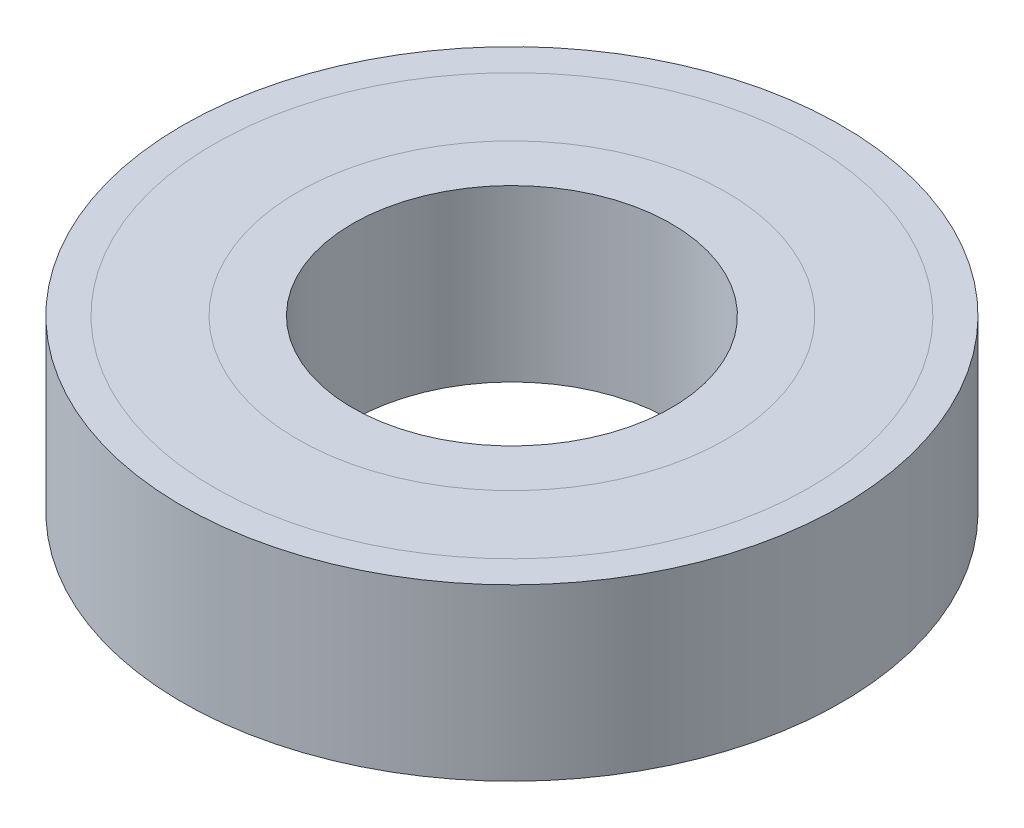
ISO-10303-21;
HEADER;
FILE_DESCRIPTION(('STEP AP214'),'2;1');
FILE_NAME('part.step','',(''),(''),'','','');
FILE_SCHEMA(('AUTOMOTIVE_DESIGN { 1 0 10303 214 1 1 1 1 }'));
ENDSEC;
DATA;
#1=APPLICATION_CONTEXT('core data for automotive mechanical design processes');
#2=APPLICATION_PROTOCOL_DEFINITION('international standard','automotive_design',2000,#1);
#3=PRODUCT_CONTEXT('',#1,'mechanical');
#4=PRODUCT('Part','Part','',(#3));
#5=PRODUCT_RELATED_PRODUCT_CATEGORY('part','',(#4));
#6=PRODUCT_DEFINITION_FORMATION('','',#4);
#7=PRODUCT_DEFINITION_CONTEXT('part definition',#1,'design');
#8=PRODUCT_DEFINITION('design','',#6,#7);
#9=PRODUCT_DEFINITION_SHAPE('','',#8);
#10=(LENGTH_UNIT() NAMED_UNIT(*) SI_UNIT(.MILLI.,.METRE.));
#11=(NAMED_UNIT(*) PLANE_ANGLE_UNIT() SI_UNIT($,.RADIAN.));
#12=(NAMED_UNIT(*) SI_UNIT($,.STERADIAN.) SOLID_ANGLE_UNIT());
#13=UNCERTAINTY_MEASURE_WITH_UNIT(LENGTH_MEASURE(1.E-05),#10,'distance_accuracy_value','');
#14=(GEOMETRIC_REPRESENTATION_CONTEXT(3) GLOBAL_UNCERTAINTY_ASSIGNED_CONTEXT((#13)) GLOBAL_UNIT_ASSIGNED_CONTEXT((#10,
#11,#12)) REPRESENTATION_CONTEXT('',''));
#15=CARTESIAN_POINT('',(0.,0.,0.));
#16=DIRECTION('',(0.,0.,1.));
#17=DIRECTION('',(1.,0.,0.));
#18=AXIS2_PLACEMENT_3D('',#15,#16,#17);
#19=CARTESIAN_POINT('',(15.,-8.,0.));
#20=DIRECTION('',(0.,1.,0.));
#21=DIRECTION('',(-1.,0.,0.));
#22=AXIS2_PLACEMENT_3D('',#19,#20,#21);
#23=PLANE('',#22);
#24=CARTESIAN_POINT('',(0.,-8.00000000000001,0.));
#25=DIRECTION('',(0.,1.,0.));
#26=DIRECTION('',(-1.,0.,0.));
#27=AXIS2_PLACEMENT_3D('',#24,#25,#26);
#28=CIRCLE('',#27,28.);
#29=CARTESIAN_POINT('',(-28.,-8.00000000000001,0.));
#30=VERTEX_POINT('',#29);
#31=EDGE_CURVE('E58',#30,#30,#28,.F.);
#32=ORIENTED_EDGE('',*,*,#31,.T.);
#33=EDGE_LOOP('',(#32));
#34=FACE_BOUND('',#33,.T.);
#35=CARTESIAN_POINT('',(0.,-8.00000000000001,0.));
#36=DIRECTION('',(0.,1.,0.));
#37=DIRECTION('',(-1.,0.,0.));
#38=AXIS2_PLACEMENT_3D('',#35,#36,#37);
#39=CIRCLE('',#38,20.15);
#40=CARTESIAN_POINT('',(-20.15,-8.00000000000001,0.));
#41=VERTEX_POINT('',#40);
#42=EDGE_CURVE('E10',#41,#41,#39,.F.);
#43=ORIENTED_EDGE('',*,*,#42,.F.);
#44=EDGE_LOOP('',(#43));
#45=FACE_BOUND('',#44,.T.);
#46=ADVANCED_FACE('F41',(#34,#45),#23,.F.);
#47=CARTESIAN_POINT('',(15.,8.,0.));
#48=DIRECTION('',(0.,-1.,0.));
#49=DIRECTION('',(1.,0.,0.));
#50=AXIS2_PLACEMENT_3D('',#47,#48,#49);
#51=PLANE('',#50);
#52=CARTESIAN_POINT('',(0.,7.99999999999999,0.));
#53=DIRECTION('',(0.,-1.,0.));
#54=DIRECTION('',(1.,0.,0.));
#55=AXIS2_PLACEMENT_3D('',#52,#53,#54);
#56=CIRCLE('',#55,28.);
#57=CARTESIAN_POINT('',(28.,8.,0.));
#58=VERTEX_POINT('',#57);
#59=EDGE_CURVE('E60',#58,#58,#56,.F.);
#60=ORIENTED_EDGE('',*,*,#59,.T.);
#61=EDGE_LOOP('',(#60));
#62=FACE_BOUND('',#61,.T.);
#63=CARTESIAN_POINT('',(0.,7.99999999999999,0.));
#64=DIRECTION('',(0.,-1.,0.));
#65=DIRECTION('',(1.,0.,0.));
#66=AXIS2_PLACEMENT_3D('',#63,#64,#65);
#67=CIRCLE('',#66,20.15);
#68=CARTESIAN_POINT('',(20.15,8.,0.));
#69=VERTEX_POINT('',#68);
#70=EDGE_CURVE('E45',#69,#69,#67,.F.);
#71=ORIENTED_EDGE('',*,*,#70,.F.);
#72=EDGE_LOOP('',(#71));
#73=FACE_BOUND('',#72,.T.);
#74=ADVANCED_FACE('F89',(#62,#73),#51,.F.);
#75=CARTESIAN_POINT('',(0.,-8.00000000000001,0.));
#76=DIRECTION('',(0.,1.,0.));
#77=DIRECTION('',(-1.,0.,0.));
#78=AXIS2_PLACEMENT_3D('',#75,#76,#77);
#79=CIRCLE('',#78,31.);
#80=CARTESIAN_POINT('',(-31.,-8.00000000000002,0.));
#81=VERTEX_POINT('',#80);
#82=EDGE_CURVE('E63',#81,#81,#79,.T.);
#83=ORIENTED_EDGE('',*,*,#82,.F.);
#84=EDGE_LOOP('',(#83));
#85=FACE_BOUND('',#84,.T.);
#86=ORIENTED_EDGE('',*,*,#31,.F.);
#87=EDGE_LOOP('',(#86));
#88=FACE_BOUND('',#87,.T.);
#89=ADVANCED_FACE('F86',(#85,#88),#23,.F.);
#90=CARTESIAN_POINT('',(0.,7.99999999999999,0.));
#91=DIRECTION('',(0.,1.,0.));
#92=DIRECTION('',(-1.,0.,0.));
#93=AXIS2_PLACEMENT_3D('',#90,#91,#92);
#94=CIRCLE('',#93,31.);
#95=CARTESIAN_POINT('',(-31.,7.99999999999998,0.));
#96=VERTEX_POINT('',#95);
#97=EDGE_CURVE('E74',#96,#96,#94,.T.);
#98=ORIENTED_EDGE('',*,*,#97,.T.);
#99=EDGE_LOOP('',(#98));
#100=FACE_BOUND('',#99,.T.);
#101=ORIENTED_EDGE('',*,*,#59,.F.);
#102=EDGE_LOOP('',(#101));
#103=FACE_BOUND('',#102,.T.);
#104=ADVANCED_FACE('F78',(#100,#103),#51,.F.);
#105=CARTESIAN_POINT('',(0.,8.,0.));
#106=DIRECTION('',(0.,1.,0.));
#107=DIRECTION('',(-1.,0.,0.));
#108=AXIS2_PLACEMENT_3D('',#105,#106,#107);
#109=CYLINDRICAL_SURFACE('',#108,31.);
#110=ORIENTED_EDGE('',*,*,#97,.F.);
#111=EDGE_LOOP('',(#110));
#112=FACE_BOUND('',#111,.T.);
#113=ORIENTED_EDGE('',*,*,#82,.T.);
#114=EDGE_LOOP('',(#113));
#115=FACE_BOUND('',#114,.T.);
#116=ADVANCED_FACE('F43',(#112,#115),#109,.T.);
#117=ORIENTED_EDGE('',*,*,#42,.T.);
#118=EDGE_LOOP('',(#117));
#119=FACE_BOUND('',#118,.T.);
#120=CARTESIAN_POINT('',(0.,-8.,0.));
#121=DIRECTION('',(0.,1.,0.));
#122=DIRECTION('',(-1.,0.,0.));
#123=AXIS2_PLACEMENT_3D('',#120,#121,#122);
#124=CIRCLE('',#123,15.);
#125=CARTESIAN_POINT('',(-15.,-8.00000000000001,0.));
#126=VERTEX_POINT('',#125);
#127=EDGE_CURVE('E68',#126,#126,#124,.T.);
#128=ORIENTED_EDGE('',*,*,#127,.T.);
#129=EDGE_LOOP('',(#128));
#130=FACE_BOUND('',#129,.T.);
#131=ADVANCED_FACE('F83',(#119,#130),#23,.F.);
#132=CARTESIAN_POINT('',(0.,8.,0.));
#133=DIRECTION('',(0.,1.,0.));
#134=DIRECTION('',(-1.,0.,0.));
#135=AXIS2_PLACEMENT_3D('',#132,#133,#134);
#136=CYLINDRICAL_SURFACE('',#135,15.);
#137=ORIENTED_EDGE('',*,*,#127,.F.);
#138=EDGE_LOOP('',(#137));
#139=FACE_BOUND('',#138,.T.);
#140=CARTESIAN_POINT('',(0.,7.99999999999999,0.));
#141=DIRECTION('',(0.,1.,0.));
#142=DIRECTION('',(-1.,0.,0.));
#143=AXIS2_PLACEMENT_3D('',#140,#141,#142);
#144=CIRCLE('',#143,15.);
#145=CARTESIAN_POINT('',(-15.,7.99999999999999,0.));
#146=VERTEX_POINT('',#145);
#147=EDGE_CURVE('E71',#146,#146,#144,.T.);
#148=ORIENTED_EDGE('',*,*,#147,.T.);
#149=EDGE_LOOP('',(#148));
#150=FACE_BOUND('',#149,.T.);
#151=ADVANCED_FACE('F103',(#139,#150),#136,.F.);
#152=ORIENTED_EDGE('',*,*,#70,.T.);
#153=EDGE_LOOP('',(#152));
#154=FACE_BOUND('',#153,.T.);
#155=ORIENTED_EDGE('',*,*,#147,.F.);
#156=EDGE_LOOP('',(#155));
#157=FACE_BOUND('',#156,.T.);
#158=ADVANCED_FACE('F100',(#154,#157),#51,.F.);
#159=CLOSED_SHELL('',(#46,#74,#89,#104,#116,#131,#151,#158));
#160=MANIFOLD_SOLID_BREP('B2',#159);
#161=ADVANCED_BREP_SHAPE_REPRESENTATION('',(#18,#160),#14);
#162=SHAPE_DEFINITION_REPRESENTATION(#9,#161);
ENDSEC;
END-ISO-10303-21;
